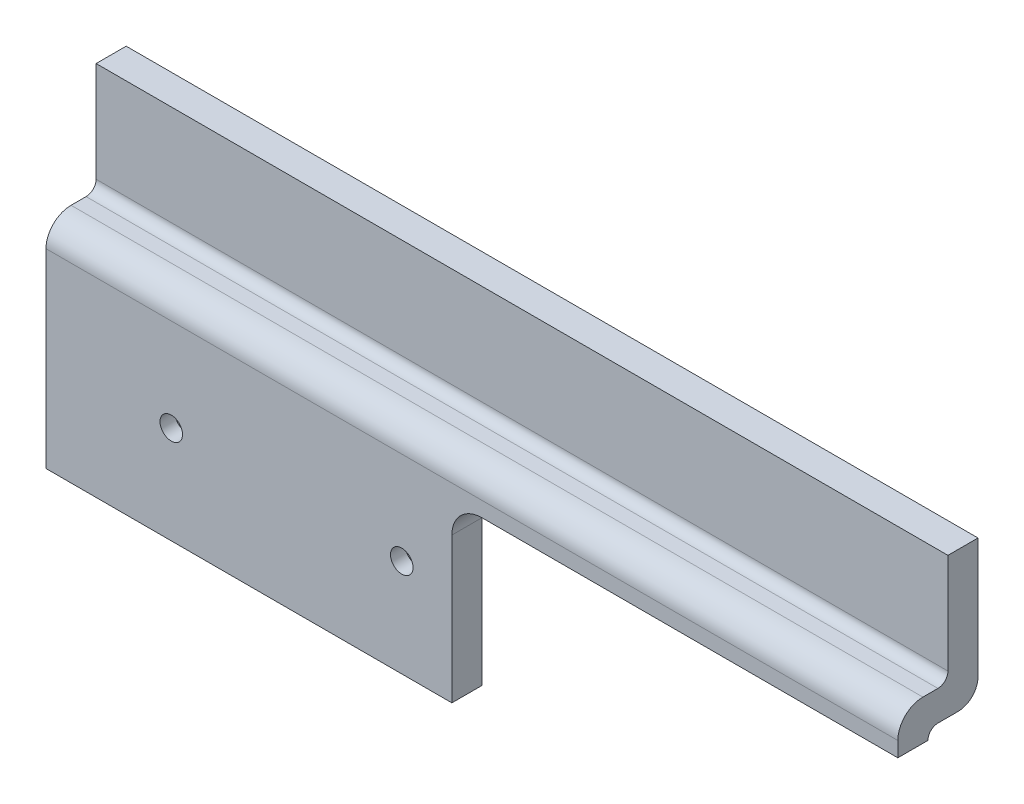
ISO-10303-21;
HEADER;
FILE_DESCRIPTION(('STEP AP214'),'2;1');
FILE_NAME('part.step','',(''),(''),'','','');
FILE_SCHEMA(('AUTOMOTIVE_DESIGN { 1 0 10303 214 1 1 1 1 }'));
ENDSEC;
DATA;
#1=APPLICATION_CONTEXT('core data for automotive mechanical design processes');
#2=APPLICATION_PROTOCOL_DEFINITION('international standard','automotive_design',2000,#1);
#3=PRODUCT_CONTEXT('',#1,'mechanical');
#4=PRODUCT('Part','Part','',(#3));
#5=PRODUCT_RELATED_PRODUCT_CATEGORY('part','',(#4));
#6=PRODUCT_DEFINITION_FORMATION('','',#4);
#7=PRODUCT_DEFINITION_CONTEXT('part definition',#1,'design');
#8=PRODUCT_DEFINITION('design','',#6,#7);
#9=PRODUCT_DEFINITION_SHAPE('','',#8);
#10=(LENGTH_UNIT() NAMED_UNIT(*) SI_UNIT(.MILLI.,.METRE.));
#11=(NAMED_UNIT(*) PLANE_ANGLE_UNIT() SI_UNIT($,.RADIAN.));
#12=(NAMED_UNIT(*) SI_UNIT($,.STERADIAN.) SOLID_ANGLE_UNIT());
#13=UNCERTAINTY_MEASURE_WITH_UNIT(LENGTH_MEASURE(1.E-05),#10,'distance_accuracy_value','');
#14=(GEOMETRIC_REPRESENTATION_CONTEXT(3) GLOBAL_UNCERTAINTY_ASSIGNED_CONTEXT((#13)) GLOBAL_UNIT_ASSIGNED_CONTEXT((#10,
#11,#12)) REPRESENTATION_CONTEXT('',''));
#15=CARTESIAN_POINT('',(0.,0.,0.));
#16=DIRECTION('',(0.,0.,1.));
#17=DIRECTION('',(1.,0.,0.));
#18=AXIS2_PLACEMENT_3D('',#15,#16,#17);
#19=CARTESIAN_POINT('',(170.,38.,0.));
#20=DIRECTION('',(0.,0.,-1.));
#21=DIRECTION('',(0.,1.,0.));
#22=AXIS2_PLACEMENT_3D('',#19,#20,#21);
#23=PLANE('',#22);
#24=CARTESIAN_POINT('',(25.,19.5,0.));
#25=DIRECTION('',(0.,0.,-1.));
#26=DIRECTION('',(0.,1.,0.));
#27=AXIS2_PLACEMENT_3D('',#24,#25,#26);
#28=CIRCLE('',#27,2.24999999999999);
#29=CARTESIAN_POINT('',(25.,21.75,0.));
#30=VERTEX_POINT('',#29);
#31=EDGE_CURVE('E170',#30,#30,#28,.T.);
#32=ORIENTED_EDGE('',*,*,#31,.T.);
#33=EDGE_LOOP('',(#32));
#34=FACE_BOUND('',#33,.T.);
#35=CARTESIAN_POINT('',(71.,19.5,0.));
#36=DIRECTION('',(0.,0.,-1.));
#37=DIRECTION('',(0.,1.,0.));
#38=AXIS2_PLACEMENT_3D('',#35,#36,#37);
#39=CIRCLE('',#38,2.25);
#40=CARTESIAN_POINT('',(71.,21.75,0.));
#41=VERTEX_POINT('',#40);
#42=EDGE_CURVE('E165',#41,#41,#39,.T.);
#43=ORIENTED_EDGE('',*,*,#42,.T.);
#44=EDGE_LOOP('',(#43));
#45=FACE_BOUND('',#44,.T.);
#46=DIRECTION('',(0.,1.,0.));
#47=VECTOR('',#46,1.);
#48=CARTESIAN_POINT('',(81.,37.9999999999999,0.));
#49=LINE('',#48,#47);
#50=CARTESIAN_POINT('',(81.,0.,0.));
#51=VERTEX_POINT('',#50);
#52=CARTESIAN_POINT('',(81.,29.,0.));
#53=VERTEX_POINT('',#52);
#54=EDGE_CURVE('E137',#51,#53,#49,.T.);
#55=ORIENTED_EDGE('',*,*,#54,.T.);
#56=CARTESIAN_POINT('',(87.,29.,0.));
#57=DIRECTION('',(0.,0.,-1.));
#58=DIRECTION('',(0.,1.,0.));
#59=AXIS2_PLACEMENT_3D('',#56,#57,#58);
#60=CIRCLE('',#59,6.);
#61=CARTESIAN_POINT('',(87.,35.,0.));
#62=VERTEX_POINT('',#61);
#63=EDGE_CURVE('E11',#53,#62,#60,.T.);
#64=ORIENTED_EDGE('',*,*,#63,.T.);
#65=DIRECTION('',(1.,0.,0.));
#66=VECTOR('',#65,1.);
#67=CARTESIAN_POINT('',(170.,35.,0.));
#68=LINE('',#67,#66);
#69=CARTESIAN_POINT('',(170.,35.,0.));
#70=VERTEX_POINT('',#69);
#71=EDGE_CURVE('E141',#62,#70,#68,.T.);
#72=ORIENTED_EDGE('',*,*,#71,.T.);
#73=DIRECTION('',(0.,-1.,0.));
#74=VECTOR('',#73,1.);
#75=CARTESIAN_POINT('',(170.,38.,0.));
#76=LINE('',#75,#74);
#77=CARTESIAN_POINT('',(170.,38.,0.));
#78=VERTEX_POINT('',#77);
#79=EDGE_CURVE('E197',#78,#70,#76,.T.);
#80=ORIENTED_EDGE('',*,*,#79,.F.);
#81=DIRECTION('',(-1.,0.,0.));
#82=VECTOR('',#81,1.);
#83=CARTESIAN_POINT('',(170.,38.,0.));
#84=LINE('',#83,#82);
#85=CARTESIAN_POINT('',(0.,38.,0.));
#86=VERTEX_POINT('',#85);
#87=EDGE_CURVE('E219',#78,#86,#84,.T.);
#88=ORIENTED_EDGE('',*,*,#87,.T.);
#89=DIRECTION('',(0.,-1.,0.));
#90=VECTOR('',#89,1.);
#91=CARTESIAN_POINT('',(0.,38.,0.));
#92=LINE('',#91,#90);
#93=CARTESIAN_POINT('',(0.,0.,0.));
#94=VERTEX_POINT('',#93);
#95=EDGE_CURVE('E168',#86,#94,#92,.T.);
#96=ORIENTED_EDGE('',*,*,#95,.T.);
#97=DIRECTION('',(-1.,0.,0.));
#98=VECTOR('',#97,1.);
#99=CARTESIAN_POINT('',(170.,0.,0.));
#100=LINE('',#99,#98);
#101=EDGE_CURVE('E155',#51,#94,#100,.T.);
#102=ORIENTED_EDGE('',*,*,#101,.F.);
#103=EDGE_LOOP('',(#55,#64,#72,#80,#88,#96,#102));
#104=FACE_BOUND('',#103,.T.);
#105=ADVANCED_FACE('F36',(#34,#45,#104),#23,.F.);
#106=CARTESIAN_POINT('',(170.,0.,0.));
#107=DIRECTION('',(0.,1.,0.));
#108=DIRECTION('',(0.,0.,1.));
#109=AXIS2_PLACEMENT_3D('',#106,#107,#108);
#110=PLANE('',#109);
#111=DIRECTION('',(-1.,0.,0.));
#112=VECTOR('',#111,1.);
#113=CARTESIAN_POINT('',(170.,0.,-6.));
#114=LINE('',#113,#112);
#115=CARTESIAN_POINT('',(81.,0.,-6.));
#116=VERTEX_POINT('',#115);
#117=CARTESIAN_POINT('',(0.,0.,-6.));
#118=VERTEX_POINT('',#117);
#119=EDGE_CURVE('E147',#116,#118,#114,.T.);
#120=ORIENTED_EDGE('',*,*,#119,.F.);
#121=DIRECTION('',(0.,0.,-1.));
#122=VECTOR('',#121,1.);
#123=CARTESIAN_POINT('',(81.,0.,164.));
#124=LINE('',#123,#122);
#125=EDGE_CURVE('E133',#51,#116,#124,.T.);
#126=ORIENTED_EDGE('',*,*,#125,.F.);
#127=ORIENTED_EDGE('',*,*,#101,.T.);
#128=DIRECTION('',(0.,0.,-1.));
#129=VECTOR('',#128,1.);
#130=CARTESIAN_POINT('',(0.,0.,0.));
#131=LINE('',#130,#129);
#132=EDGE_CURVE('E153',#94,#118,#131,.T.);
#133=ORIENTED_EDGE('',*,*,#132,.T.);
#134=EDGE_LOOP('',(#120,#126,#127,#133));
#135=FACE_BOUND('',#134,.T.);
#136=ADVANCED_FACE('F151',(#135),#110,.F.);
#137=CARTESIAN_POINT('',(170.,0.,-6.));
#138=DIRECTION('',(0.,0.,1.));
#139=DIRECTION('',(1.,0.,0.));
#140=AXIS2_PLACEMENT_3D('',#137,#138,#139);
#141=PLANE('',#140);
#142=CARTESIAN_POINT('',(25.,19.5,-6.));
#143=DIRECTION('',(0.,0.,-1.));
#144=DIRECTION('',(-1.,0.,0.));
#145=AXIS2_PLACEMENT_3D('',#142,#143,#144);
#146=CIRCLE('',#145,4.99999999999999);
#147=CARTESIAN_POINT('',(20.,19.5,-6.));
#148=VERTEX_POINT('',#147);
#149=EDGE_CURVE('E311',#148,#148,#146,.T.);
#150=ORIENTED_EDGE('',*,*,#149,.F.);
#151=EDGE_LOOP('',(#150));
#152=FACE_BOUND('',#151,.T.);
#153=CARTESIAN_POINT('',(71.,19.5,-6.));
#154=DIRECTION('',(0.,0.,-1.));
#155=DIRECTION('',(-1.,0.,0.));
#156=AXIS2_PLACEMENT_3D('',#153,#154,#155);
#157=CIRCLE('',#156,4.99999999999999);
#158=CARTESIAN_POINT('',(66.,19.5,-6.));
#159=VERTEX_POINT('',#158);
#160=EDGE_CURVE('E173',#159,#159,#157,.T.);
#161=ORIENTED_EDGE('',*,*,#160,.F.);
#162=EDGE_LOOP('',(#161));
#163=FACE_BOUND('',#162,.T.);
#164=DIRECTION('',(-1.,0.,0.));
#165=VECTOR('',#164,1.);
#166=CARTESIAN_POINT('',(170.,35.,-6.));
#167=LINE('',#166,#165);
#168=CARTESIAN_POINT('',(87.,35.,-6.));
#169=VERTEX_POINT('',#168);
#170=CARTESIAN_POINT('',(0.,35.,-6.));
#171=VERTEX_POINT('',#170);
#172=EDGE_CURVE('E161',#169,#171,#167,.T.);
#173=ORIENTED_EDGE('',*,*,#172,.F.);
#174=CARTESIAN_POINT('',(87.,29.,-6.00000000000001));
#175=DIRECTION('',(0.,0.,1.));
#176=DIRECTION('',(1.,0.,0.));
#177=AXIS2_PLACEMENT_3D('',#174,#175,#176);
#178=CIRCLE('',#177,6.);
#179=CARTESIAN_POINT('',(81.,29.,-6.));
#180=VERTEX_POINT('',#179);
#181=EDGE_CURVE('E45',#169,#180,#178,.T.);
#182=ORIENTED_EDGE('',*,*,#181,.T.);
#183=DIRECTION('',(0.,1.,0.));
#184=VECTOR('',#183,1.);
#185=CARTESIAN_POINT('',(81.,0.,-6.));
#186=LINE('',#185,#184);
#187=EDGE_CURVE('E136',#116,#180,#186,.T.);
#188=ORIENTED_EDGE('',*,*,#187,.F.);
#189=ORIENTED_EDGE('',*,*,#119,.T.);
#190=DIRECTION('',(0.,1.,0.));
#191=VECTOR('',#190,1.);
#192=CARTESIAN_POINT('',(0.,0.,-6.));
#193=LINE('',#192,#191);
#194=EDGE_CURVE('E223',#118,#171,#193,.T.);
#195=ORIENTED_EDGE('',*,*,#194,.T.);
#196=EDGE_LOOP('',(#173,#182,#188,#189,#195));
#197=FACE_BOUND('',#196,.T.);
#198=ADVANCED_FACE('F145',(#152,#163,#197),#141,.F.);
#199=CARTESIAN_POINT('',(170.,35.,-8.));
#200=DIRECTION('',(-1.,0.,0.));
#201=DIRECTION('',(0.,0.,1.));
#202=AXIS2_PLACEMENT_3D('',#199,#200,#201);
#203=CYLINDRICAL_SURFACE('',#202,2.);
#204=CARTESIAN_POINT('',(0.,35.,-8.));
#205=DIRECTION('',(-1.,0.,0.));
#206=DIRECTION('',(0.,0.,-1.));
#207=AXIS2_PLACEMENT_3D('',#204,#205,#206);
#208=CIRCLE('',#207,2.);
#209=CARTESIAN_POINT('',(0.,37.,-8.00000000000001));
#210=VERTEX_POINT('',#209);
#211=EDGE_CURVE('E225',#171,#210,#208,.T.);
#212=ORIENTED_EDGE('',*,*,#211,.T.);
#213=DIRECTION('',(-1.,0.,0.));
#214=VECTOR('',#213,1.);
#215=CARTESIAN_POINT('',(170.,37.,-8.00000000000001));
#216=LINE('',#215,#214);
#217=CARTESIAN_POINT('',(170.,37.,-8.00000000000001));
#218=VERTEX_POINT('',#217);
#219=EDGE_CURVE('E193',#218,#210,#216,.T.);
#220=ORIENTED_EDGE('',*,*,#219,.F.);
#221=CARTESIAN_POINT('',(170.,35.,-8.));
#222=DIRECTION('',(-1.,0.,0.));
#223=DIRECTION('',(0.,0.,-1.));
#224=AXIS2_PLACEMENT_3D('',#221,#222,#223);
#225=CIRCLE('',#224,2.);
#226=CARTESIAN_POINT('',(170.,35.,-6.));
#227=VERTEX_POINT('',#226);
#228=EDGE_CURVE('E191',#227,#218,#225,.T.);
#229=ORIENTED_EDGE('',*,*,#228,.F.);
#230=EDGE_CURVE('E156',#227,#169,#167,.T.);
#231=ORIENTED_EDGE('',*,*,#230,.T.);
#232=ORIENTED_EDGE('',*,*,#172,.T.);
#233=EDGE_LOOP('',(#212,#220,#229,#231,#232));
#234=FACE_BOUND('',#233,.T.);
#235=ADVANCED_FACE('F189',(#234),#203,.F.);
#236=CARTESIAN_POINT('',(170.,37.,-8.00000000000001));
#237=DIRECTION('',(0.,1.,0.));
#238=DIRECTION('',(0.,0.,1.));
#239=AXIS2_PLACEMENT_3D('',#236,#237,#238);
#240=PLANE('',#239);
#241=DIRECTION('',(0.,0.,-1.));
#242=VECTOR('',#241,1.);
#243=CARTESIAN_POINT('',(0.,37.,-8.00000000000001));
#244=LINE('',#243,#242);
#245=CARTESIAN_POINT('',(0.,37.,-12.));
#246=VERTEX_POINT('',#245);
#247=EDGE_CURVE('E227',#210,#246,#244,.T.);
#248=ORIENTED_EDGE('',*,*,#247,.T.);
#249=DIRECTION('',(-1.,0.,0.));
#250=VECTOR('',#249,1.);
#251=CARTESIAN_POINT('',(170.,37.,-12.));
#252=LINE('',#251,#250);
#253=CARTESIAN_POINT('',(170.,37.,-12.));
#254=VERTEX_POINT('',#253);
#255=EDGE_CURVE('E262',#254,#246,#252,.T.);
#256=ORIENTED_EDGE('',*,*,#255,.F.);
#257=DIRECTION('',(0.,0.,-1.));
#258=VECTOR('',#257,1.);
#259=CARTESIAN_POINT('',(170.,37.,-8.00000000000001));
#260=LINE('',#259,#258);
#261=EDGE_CURVE('E196',#218,#254,#260,.T.);
#262=ORIENTED_EDGE('',*,*,#261,.F.);
#263=ORIENTED_EDGE('',*,*,#219,.T.);
#264=EDGE_LOOP('',(#248,#256,#262,#263));
#265=FACE_BOUND('',#264,.T.);
#266=ADVANCED_FACE('F266',(#265),#240,.F.);
#267=CARTESIAN_POINT('',(170.,41.,-12.));
#268=DIRECTION('',(-1.,0.,0.));
#269=DIRECTION('',(0.,0.,1.));
#270=AXIS2_PLACEMENT_3D('',#267,#268,#269);
#271=CYLINDRICAL_SURFACE('',#270,4.);
#272=CARTESIAN_POINT('',(0.,41.,-12.));
#273=DIRECTION('',(1.,0.,0.));
#274=DIRECTION('',(0.,0.,-1.));
#275=AXIS2_PLACEMENT_3D('',#272,#273,#274);
#276=CIRCLE('',#275,4.);
#277=CARTESIAN_POINT('',(0.,41.,-16.));
#278=VERTEX_POINT('',#277);
#279=EDGE_CURVE('E229',#246,#278,#276,.T.);
#280=ORIENTED_EDGE('',*,*,#279,.T.);
#281=DIRECTION('',(-1.,0.,0.));
#282=VECTOR('',#281,1.);
#283=CARTESIAN_POINT('',(170.,41.,-16.));
#284=LINE('',#283,#282);
#285=CARTESIAN_POINT('',(170.,41.,-16.));
#286=VERTEX_POINT('',#285);
#287=EDGE_CURVE('E259',#286,#278,#284,.T.);
#288=ORIENTED_EDGE('',*,*,#287,.F.);
#289=CARTESIAN_POINT('',(170.,41.,-12.));
#290=DIRECTION('',(1.,0.,0.));
#291=DIRECTION('',(0.,0.,-1.));
#292=AXIS2_PLACEMENT_3D('',#289,#290,#291);
#293=CIRCLE('',#292,4.);
#294=EDGE_CURVE('E199',#254,#286,#293,.T.);
#295=ORIENTED_EDGE('',*,*,#294,.F.);
#296=ORIENTED_EDGE('',*,*,#255,.T.);
#297=EDGE_LOOP('',(#280,#288,#295,#296));
#298=FACE_BOUND('',#297,.T.);
#299=ADVANCED_FACE('F277',(#298),#271,.T.);
#300=CARTESIAN_POINT('',(170.,41.,-16.));
#301=DIRECTION('',(0.,0.,1.));
#302=DIRECTION('',(1.,0.,0.));
#303=AXIS2_PLACEMENT_3D('',#300,#301,#302);
#304=PLANE('',#303);
#305=DIRECTION('',(0.,1.,0.));
#306=VECTOR('',#305,1.);
#307=CARTESIAN_POINT('',(0.,41.,-16.));
#308=LINE('',#307,#306);
#309=CARTESIAN_POINT('',(0.,65.,-16.));
#310=VERTEX_POINT('',#309);
#311=EDGE_CURVE('E231',#278,#310,#308,.T.);
#312=ORIENTED_EDGE('',*,*,#311,.T.);
#313=DIRECTION('',(-1.,0.,0.));
#314=VECTOR('',#313,1.);
#315=CARTESIAN_POINT('',(170.,65.,-16.));
#316=LINE('',#315,#314);
#317=CARTESIAN_POINT('',(170.,65.,-16.));
#318=VERTEX_POINT('',#317);
#319=EDGE_CURVE('E256',#318,#310,#316,.T.);
#320=ORIENTED_EDGE('',*,*,#319,.F.);
#321=DIRECTION('',(0.,1.,0.));
#322=VECTOR('',#321,1.);
#323=CARTESIAN_POINT('',(170.,41.,-16.));
#324=LINE('',#323,#322);
#325=EDGE_CURVE('E207',#286,#318,#324,.T.);
#326=ORIENTED_EDGE('',*,*,#325,.F.);
#327=ORIENTED_EDGE('',*,*,#287,.T.);
#328=EDGE_LOOP('',(#312,#320,#326,#327));
#329=FACE_BOUND('',#328,.T.);
#330=ADVANCED_FACE('F281',(#329),#304,.F.);
#331=CARTESIAN_POINT('',(170.,65.,-16.));
#332=DIRECTION('',(0.,-1.,0.));
#333=DIRECTION('',(0.,0.,-1.));
#334=AXIS2_PLACEMENT_3D('',#331,#332,#333);
#335=PLANE('',#334);
#336=DIRECTION('',(0.,0.,1.));
#337=VECTOR('',#336,1.);
#338=CARTESIAN_POINT('',(0.,65.,-16.));
#339=LINE('',#338,#337);
#340=CARTESIAN_POINT('',(0.,65.,-10.));
#341=VERTEX_POINT('',#340);
#342=EDGE_CURVE('E233',#310,#341,#339,.T.);
#343=ORIENTED_EDGE('',*,*,#342,.T.);
#344=DIRECTION('',(-1.,0.,0.));
#345=VECTOR('',#344,1.);
#346=CARTESIAN_POINT('',(170.,65.,-10.));
#347=LINE('',#346,#345);
#348=CARTESIAN_POINT('',(170.,65.,-10.));
#349=VERTEX_POINT('',#348);
#350=EDGE_CURVE('E253',#349,#341,#347,.T.);
#351=ORIENTED_EDGE('',*,*,#350,.F.);
#352=DIRECTION('',(0.,0.,1.));
#353=VECTOR('',#352,1.);
#354=CARTESIAN_POINT('',(170.,65.,-16.));
#355=LINE('',#354,#353);
#356=EDGE_CURVE('E209',#318,#349,#355,.T.);
#357=ORIENTED_EDGE('',*,*,#356,.F.);
#358=ORIENTED_EDGE('',*,*,#319,.T.);
#359=EDGE_LOOP('',(#343,#351,#357,#358));
#360=FACE_BOUND('',#359,.T.);
#361=ADVANCED_FACE('F289',(#360),#335,.F.);
#362=CARTESIAN_POINT('',(170.,65.,-10.));
#363=DIRECTION('',(0.,0.,-1.));
#364=DIRECTION('',(0.,1.,0.));
#365=AXIS2_PLACEMENT_3D('',#362,#363,#364);
#366=PLANE('',#365);
#367=DIRECTION('',(0.,-1.,0.));
#368=VECTOR('',#367,1.);
#369=CARTESIAN_POINT('',(0.,65.,-10.));
#370=LINE('',#369,#368);
#371=CARTESIAN_POINT('',(0.,45.,-10.));
#372=VERTEX_POINT('',#371);
#373=EDGE_CURVE('E235',#341,#372,#370,.T.);
#374=ORIENTED_EDGE('',*,*,#373,.T.);
#375=DIRECTION('',(-1.,0.,0.));
#376=VECTOR('',#375,1.);
#377=CARTESIAN_POINT('',(170.,45.,-10.));
#378=LINE('',#377,#376);
#379=CARTESIAN_POINT('',(170.,45.,-10.));
#380=VERTEX_POINT('',#379);
#381=EDGE_CURVE('E250',#380,#372,#378,.T.);
#382=ORIENTED_EDGE('',*,*,#381,.F.);
#383=DIRECTION('',(0.,-1.,0.));
#384=VECTOR('',#383,1.);
#385=CARTESIAN_POINT('',(170.,65.,-10.));
#386=LINE('',#385,#384);
#387=EDGE_CURVE('E211',#349,#380,#386,.T.);
#388=ORIENTED_EDGE('',*,*,#387,.F.);
#389=ORIENTED_EDGE('',*,*,#350,.T.);
#390=EDGE_LOOP('',(#374,#382,#388,#389));
#391=FACE_BOUND('',#390,.T.);
#392=ADVANCED_FACE('F292',(#391),#366,.F.);
#393=CARTESIAN_POINT('',(170.,45.,-8.00000000000001));
#394=DIRECTION('',(-1.,0.,0.));
#395=DIRECTION('',(0.,0.,1.));
#396=AXIS2_PLACEMENT_3D('',#393,#394,#395);
#397=CYLINDRICAL_SURFACE('',#396,2.);
#398=CARTESIAN_POINT('',(0.,45.,-8.00000000000001));
#399=DIRECTION('',(-1.,0.,0.));
#400=DIRECTION('',(0.,0.,1.));
#401=AXIS2_PLACEMENT_3D('',#398,#399,#400);
#402=CIRCLE('',#401,2.);
#403=CARTESIAN_POINT('',(0.,43.,-7.99999999999999));
#404=VERTEX_POINT('',#403);
#405=EDGE_CURVE('E237',#372,#404,#402,.T.);
#406=ORIENTED_EDGE('',*,*,#405,.T.);
#407=DIRECTION('',(-1.,0.,0.));
#408=VECTOR('',#407,1.);
#409=CARTESIAN_POINT('',(170.,43.,-7.99999999999999));
#410=LINE('',#409,#408);
#411=CARTESIAN_POINT('',(170.,43.,-7.99999999999999));
#412=VERTEX_POINT('',#411);
#413=EDGE_CURVE('E247',#412,#404,#410,.T.);
#414=ORIENTED_EDGE('',*,*,#413,.F.);
#415=CARTESIAN_POINT('',(170.,45.,-8.00000000000001));
#416=DIRECTION('',(-1.,0.,0.));
#417=DIRECTION('',(0.,0.,1.));
#418=AXIS2_PLACEMENT_3D('',#415,#416,#417);
#419=CIRCLE('',#418,2.);
#420=EDGE_CURVE('E213',#380,#412,#419,.T.);
#421=ORIENTED_EDGE('',*,*,#420,.F.);
#422=ORIENTED_EDGE('',*,*,#381,.T.);
#423=EDGE_LOOP('',(#406,#414,#421,#422));
#424=FACE_BOUND('',#423,.T.);
#425=ADVANCED_FACE('F297',(#424),#397,.F.);
#426=CARTESIAN_POINT('',(170.,43.,-7.99999999999999));
#427=DIRECTION('',(0.,-1.,0.));
#428=DIRECTION('',(0.,0.,-1.));
#429=AXIS2_PLACEMENT_3D('',#426,#427,#428);
#430=PLANE('',#429);
#431=DIRECTION('',(0.,0.,1.));
#432=VECTOR('',#431,1.);
#433=CARTESIAN_POINT('',(0.,43.,-7.99999999999999));
#434=LINE('',#433,#432);
#435=CARTESIAN_POINT('',(0.,43.,-5.00000000000003));
#436=VERTEX_POINT('',#435);
#437=EDGE_CURVE('E239',#404,#436,#434,.T.);
#438=ORIENTED_EDGE('',*,*,#437,.T.);
#439=DIRECTION('',(-1.,0.,0.));
#440=VECTOR('',#439,1.);
#441=CARTESIAN_POINT('',(170.,43.,-5.00000000000003));
#442=LINE('',#441,#440);
#443=CARTESIAN_POINT('',(170.,43.,-5.00000000000003));
#444=VERTEX_POINT('',#443);
#445=EDGE_CURVE('E244',#444,#436,#442,.T.);
#446=ORIENTED_EDGE('',*,*,#445,.F.);
#447=DIRECTION('',(0.,0.,1.));
#448=VECTOR('',#447,1.);
#449=CARTESIAN_POINT('',(170.,43.,-7.99999999999999));
#450=LINE('',#449,#448);
#451=EDGE_CURVE('E215',#412,#444,#450,.T.);
#452=ORIENTED_EDGE('',*,*,#451,.F.);
#453=ORIENTED_EDGE('',*,*,#413,.T.);
#454=EDGE_LOOP('',(#438,#446,#452,#453));
#455=FACE_BOUND('',#454,.T.);
#456=ADVANCED_FACE('F303',(#455),#430,.F.);
#457=CARTESIAN_POINT('',(170.,38.,-5.));
#458=DIRECTION('',(-1.,0.,0.));
#459=DIRECTION('',(0.,0.,1.));
#460=AXIS2_PLACEMENT_3D('',#457,#458,#459);
#461=CYLINDRICAL_SURFACE('',#460,5.);
#462=CARTESIAN_POINT('',(0.,38.,-5.));
#463=DIRECTION('',(1.,0.,0.));
#464=DIRECTION('',(0.,0.,-1.));
#465=AXIS2_PLACEMENT_3D('',#462,#463,#464);
#466=CIRCLE('',#465,5.);
#467=EDGE_CURVE('E202',#436,#86,#466,.T.);
#468=ORIENTED_EDGE('',*,*,#467,.T.);
#469=ORIENTED_EDGE('',*,*,#87,.F.);
#470=CARTESIAN_POINT('',(170.,38.,-5.));
#471=DIRECTION('',(1.,0.,0.));
#472=DIRECTION('',(0.,0.,-1.));
#473=AXIS2_PLACEMENT_3D('',#470,#471,#472);
#474=CIRCLE('',#473,5.);
#475=EDGE_CURVE('E217',#444,#78,#474,.T.);
#476=ORIENTED_EDGE('',*,*,#475,.F.);
#477=ORIENTED_EDGE('',*,*,#445,.T.);
#478=EDGE_LOOP('',(#468,#469,#476,#477));
#479=FACE_BOUND('',#478,.T.);
#480=ADVANCED_FACE('F307',(#479),#461,.T.);
#481=CARTESIAN_POINT('',(170.,35.,-8.));
#482=DIRECTION('',(1.,0.,0.));
#483=DIRECTION('',(0.,0.,-1.));
#484=AXIS2_PLACEMENT_3D('',#481,#482,#483);
#485=PLANE('',#484);
#486=DIRECTION('',(0.,0.,1.));
#487=VECTOR('',#486,1.);
#488=CARTESIAN_POINT('',(170.,35.,-8.));
#489=LINE('',#488,#487);
#490=EDGE_CURVE('E158',#227,#70,#489,.T.);
#491=ORIENTED_EDGE('',*,*,#490,.F.);
#492=ORIENTED_EDGE('',*,*,#228,.T.);
#493=ORIENTED_EDGE('',*,*,#261,.T.);
#494=ORIENTED_EDGE('',*,*,#294,.T.);
#495=ORIENTED_EDGE('',*,*,#325,.T.);
#496=ORIENTED_EDGE('',*,*,#356,.T.);
#497=ORIENTED_EDGE('',*,*,#387,.T.);
#498=ORIENTED_EDGE('',*,*,#420,.T.);
#499=ORIENTED_EDGE('',*,*,#451,.T.);
#500=ORIENTED_EDGE('',*,*,#475,.T.);
#501=ORIENTED_EDGE('',*,*,#79,.T.);
#502=EDGE_LOOP('',(#491,#492,#493,#494,#495,#496,#497,#498,#499,#500,#501));
#503=FACE_BOUND('',#502,.T.);
#504=ADVANCED_FACE('F284',(#503),#485,.T.);
#505=CARTESIAN_POINT('',(0.,35.,-8.));
#506=DIRECTION('',(1.,0.,0.));
#507=DIRECTION('',(0.,0.,-1.));
#508=AXIS2_PLACEMENT_3D('',#505,#506,#507);
#509=PLANE('',#508);
#510=ORIENTED_EDGE('',*,*,#95,.F.);
#511=ORIENTED_EDGE('',*,*,#467,.F.);
#512=ORIENTED_EDGE('',*,*,#437,.F.);
#513=ORIENTED_EDGE('',*,*,#405,.F.);
#514=ORIENTED_EDGE('',*,*,#373,.F.);
#515=ORIENTED_EDGE('',*,*,#342,.F.);
#516=ORIENTED_EDGE('',*,*,#311,.F.);
#517=ORIENTED_EDGE('',*,*,#279,.F.);
#518=ORIENTED_EDGE('',*,*,#247,.F.);
#519=ORIENTED_EDGE('',*,*,#211,.F.);
#520=ORIENTED_EDGE('',*,*,#194,.F.);
#521=ORIENTED_EDGE('',*,*,#132,.F.);
#522=EDGE_LOOP('',(#510,#511,#512,#513,#514,#515,#516,#517,#518,#519,#520,#521));
#523=FACE_BOUND('',#522,.T.);
#524=ADVANCED_FACE('F272',(#523),#509,.F.);
#525=CARTESIAN_POINT('',(71.,19.5,-6.));
#526=DIRECTION('',(0.,0.,-1.));
#527=DIRECTION('',(-1.,0.,0.));
#528=AXIS2_PLACEMENT_3D('',#525,#526,#527);
#529=CYLINDRICAL_SURFACE('',#528,2.25);
#530=CARTESIAN_POINT('',(71.,19.5,-3.));
#531=DIRECTION('',(0.,0.,-1.));
#532=DIRECTION('',(-1.,0.,0.));
#533=AXIS2_PLACEMENT_3D('',#530,#531,#532);
#534=CIRCLE('',#533,2.25);
#535=CARTESIAN_POINT('',(68.75,19.5,-3.));
#536=VERTEX_POINT('',#535);
#537=EDGE_CURVE('E169',#536,#536,#534,.T.);
#538=ORIENTED_EDGE('',*,*,#537,.T.);
#539=EDGE_LOOP('',(#538));
#540=FACE_BOUND('',#539,.T.);
#541=ORIENTED_EDGE('',*,*,#42,.F.);
#542=EDGE_LOOP('',(#541));
#543=FACE_BOUND('',#542,.T.);
#544=ADVANCED_FACE('F328',(#540,#543),#529,.F.);
#545=CARTESIAN_POINT('',(73.25,19.5,-3.));
#546=DIRECTION('',(0.,0.,1.));
#547=DIRECTION('',(1.,0.,0.));
#548=AXIS2_PLACEMENT_3D('',#545,#546,#547);
#549=PLANE('',#548);
#550=ORIENTED_EDGE('',*,*,#537,.F.);
#551=EDGE_LOOP('',(#550));
#552=FACE_BOUND('',#551,.T.);
#553=CARTESIAN_POINT('',(71.,19.5,-3.));
#554=DIRECTION('',(0.,0.,-1.));
#555=DIRECTION('',(-1.,0.,0.));
#556=AXIS2_PLACEMENT_3D('',#553,#554,#555);
#557=CIRCLE('',#556,4.99999999999999);
#558=CARTESIAN_POINT('',(66.,19.5,-3.));
#559=VERTEX_POINT('',#558);
#560=EDGE_CURVE('E323',#559,#559,#557,.T.);
#561=ORIENTED_EDGE('',*,*,#560,.T.);
#562=EDGE_LOOP('',(#561));
#563=FACE_BOUND('',#562,.T.);
#564=ADVANCED_FACE('F331',(#552,#563),#549,.F.);
#565=CARTESIAN_POINT('',(71.,19.5,-6.));
#566=DIRECTION('',(0.,0.,-1.));
#567=DIRECTION('',(-1.,0.,0.));
#568=AXIS2_PLACEMENT_3D('',#565,#566,#567);
#569=CYLINDRICAL_SURFACE('',#568,4.99999999999999);
#570=ORIENTED_EDGE('',*,*,#560,.F.);
#571=EDGE_LOOP('',(#570));
#572=FACE_BOUND('',#571,.T.);
#573=ORIENTED_EDGE('',*,*,#160,.T.);
#574=EDGE_LOOP('',(#573));
#575=FACE_BOUND('',#574,.T.);
#576=ADVANCED_FACE('F334',(#572,#575),#569,.F.);
#577=CARTESIAN_POINT('',(25.,19.5,-6.));
#578=DIRECTION('',(0.,0.,-1.));
#579=DIRECTION('',(-1.,0.,0.));
#580=AXIS2_PLACEMENT_3D('',#577,#578,#579);
#581=CYLINDRICAL_SURFACE('',#580,2.24999999999999);
#582=CARTESIAN_POINT('',(25.,19.5,-3.));
#583=DIRECTION('',(0.,0.,-1.));
#584=DIRECTION('',(-1.,0.,0.));
#585=AXIS2_PLACEMENT_3D('',#582,#583,#584);
#586=CIRCLE('',#585,2.25);
#587=CARTESIAN_POINT('',(22.75,19.5,-3.));
#588=VERTEX_POINT('',#587);
#589=EDGE_CURVE('E174',#588,#588,#586,.T.);
#590=ORIENTED_EDGE('',*,*,#589,.T.);
#591=EDGE_LOOP('',(#590));
#592=FACE_BOUND('',#591,.T.);
#593=ORIENTED_EDGE('',*,*,#31,.F.);
#594=EDGE_LOOP('',(#593));
#595=FACE_BOUND('',#594,.T.);
#596=ADVANCED_FACE('F340',(#592,#595),#581,.F.);
#597=CARTESIAN_POINT('',(27.25,19.5,-3.));
#598=DIRECTION('',(0.,0.,1.));
#599=DIRECTION('',(1.,0.,0.));
#600=AXIS2_PLACEMENT_3D('',#597,#598,#599);
#601=PLANE('',#600);
#602=ORIENTED_EDGE('',*,*,#589,.F.);
#603=EDGE_LOOP('',(#602));
#604=FACE_BOUND('',#603,.T.);
#605=CARTESIAN_POINT('',(25.,19.5,-3.));
#606=DIRECTION('',(0.,0.,-1.));
#607=DIRECTION('',(-1.,0.,0.));
#608=AXIS2_PLACEMENT_3D('',#605,#606,#607);
#609=CIRCLE('',#608,4.99999999999999);
#610=CARTESIAN_POINT('',(20.,19.5,-3.));
#611=VERTEX_POINT('',#610);
#612=EDGE_CURVE('E316',#611,#611,#609,.T.);
#613=ORIENTED_EDGE('',*,*,#612,.T.);
#614=EDGE_LOOP('',(#613));
#615=FACE_BOUND('',#614,.T.);
#616=ADVANCED_FACE('F455',(#604,#615),#601,.F.);
#617=CARTESIAN_POINT('',(25.,19.5,-6.));
#618=DIRECTION('',(0.,0.,-1.));
#619=DIRECTION('',(-1.,0.,0.));
#620=AXIS2_PLACEMENT_3D('',#617,#618,#619);
#621=CYLINDRICAL_SURFACE('',#620,4.99999999999999);
#622=ORIENTED_EDGE('',*,*,#612,.F.);
#623=EDGE_LOOP('',(#622));
#624=FACE_BOUND('',#623,.T.);
#625=ORIENTED_EDGE('',*,*,#149,.T.);
#626=EDGE_LOOP('',(#625));
#627=FACE_BOUND('',#626,.T.);
#628=ADVANCED_FACE('F466',(#624,#627),#621,.F.);
#629=CARTESIAN_POINT('',(81.,0.,164.));
#630=DIRECTION('',(-1.,0.,0.));
#631=DIRECTION('',(0.,-1.,0.));
#632=AXIS2_PLACEMENT_3D('',#629,#630,#631);
#633=PLANE('',#632);
#634=ORIENTED_EDGE('',*,*,#187,.T.);
#635=DIRECTION('',(0.,0.,-1.));
#636=VECTOR('',#635,1.);
#637=CARTESIAN_POINT('',(81.,29.,0.));
#638=LINE('',#637,#636);
#639=EDGE_CURVE('E52',#180,#53,#638,.F.);
#640=ORIENTED_EDGE('',*,*,#639,.T.);
#641=ORIENTED_EDGE('',*,*,#54,.F.);
#642=ORIENTED_EDGE('',*,*,#125,.T.);
#643=EDGE_LOOP('',(#634,#640,#641,#642));
#644=FACE_BOUND('',#643,.T.);
#645=ADVANCED_FACE('F135',(#644),#633,.F.);
#646=CARTESIAN_POINT('',(170.,35.,164.));
#647=DIRECTION('',(0.,1.,0.));
#648=DIRECTION('',(0.,0.,1.));
#649=AXIS2_PLACEMENT_3D('',#646,#647,#648);
#650=PLANE('',#649);
#651=ORIENTED_EDGE('',*,*,#71,.F.);
#652=DIRECTION('',(0.,0.,-1.));
#653=VECTOR('',#652,1.);
#654=CARTESIAN_POINT('',(87.,35.,-6.00000000000001));
#655=LINE('',#654,#653);
#656=EDGE_CURVE('E177',#62,#169,#655,.T.);
#657=ORIENTED_EDGE('',*,*,#656,.T.);
#658=ORIENTED_EDGE('',*,*,#230,.F.);
#659=ORIENTED_EDGE('',*,*,#490,.T.);
#660=EDGE_LOOP('',(#651,#657,#658,#659));
#661=FACE_BOUND('',#660,.T.);
#662=ADVANCED_FACE('F183',(#661),#650,.F.);
#663=CARTESIAN_POINT('',(87.,29.,164.));
#664=DIRECTION('',(0.,0.,1.));
#665=DIRECTION('',(1.,0.,0.));
#666=AXIS2_PLACEMENT_3D('',#663,#664,#665);
#667=CYLINDRICAL_SURFACE('',#666,6.);
#668=ORIENTED_EDGE('',*,*,#63,.F.);
#669=ORIENTED_EDGE('',*,*,#639,.F.);
#670=ORIENTED_EDGE('',*,*,#181,.F.);
#671=ORIENTED_EDGE('',*,*,#656,.F.);
#672=EDGE_LOOP('',(#668,#669,#670,#671));
#673=FACE_BOUND('',#672,.T.);
#674=ADVANCED_FACE('F38',(#673),#667,.F.);
#675=CLOSED_SHELL('',(#105,#136,#198,#235,#266,#299,#330,#361,#392,#425,#456,#480,#504,#524,
#544,#564,#576,#596,#616,#628,#645,#662,#674));
#676=MANIFOLD_SOLID_BREP('B2',#675);
#677=ADVANCED_BREP_SHAPE_REPRESENTATION('',(#18,#676),#14);
#678=SHAPE_DEFINITION_REPRESENTATION(#9,#677);
ENDSEC;
END-ISO-10303-21;
